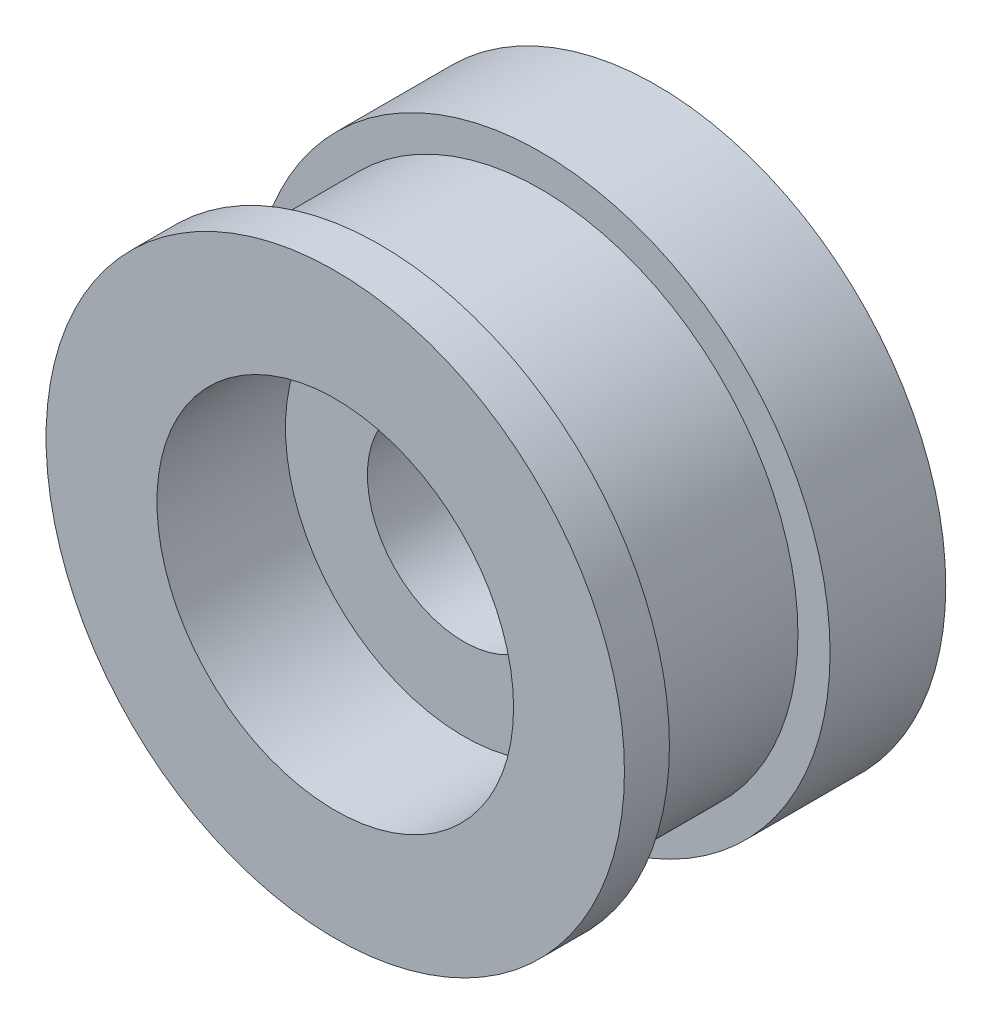
ISO-10303-21;
HEADER;
FILE_DESCRIPTION(('STEP AP214'),'2;1');
FILE_NAME('part.step','',(''),(''),'','','');
FILE_SCHEMA(('AUTOMOTIVE_DESIGN { 1 0 10303 214 1 1 1 1 }'));
ENDSEC;
DATA;
#1=APPLICATION_CONTEXT('core data for automotive mechanical design processes');
#2=APPLICATION_PROTOCOL_DEFINITION('international standard','automotive_design',2000,#1);
#3=PRODUCT_CONTEXT('',#1,'mechanical');
#4=PRODUCT('Part','Part','',(#3));
#5=PRODUCT_RELATED_PRODUCT_CATEGORY('part','',(#4));
#6=PRODUCT_DEFINITION_FORMATION('','',#4);
#7=PRODUCT_DEFINITION_CONTEXT('part definition',#1,'design');
#8=PRODUCT_DEFINITION('design','',#6,#7);
#9=PRODUCT_DEFINITION_SHAPE('','',#8);
#10=(LENGTH_UNIT() NAMED_UNIT(*) SI_UNIT(.MILLI.,.METRE.));
#11=(NAMED_UNIT(*) PLANE_ANGLE_UNIT() SI_UNIT($,.RADIAN.));
#12=(NAMED_UNIT(*) SI_UNIT($,.STERADIAN.) SOLID_ANGLE_UNIT());
#13=UNCERTAINTY_MEASURE_WITH_UNIT(LENGTH_MEASURE(1.E-05),#10,'distance_accuracy_value','');
#14=(GEOMETRIC_REPRESENTATION_CONTEXT(3) GLOBAL_UNCERTAINTY_ASSIGNED_CONTEXT((#13)) GLOBAL_UNIT_ASSIGNED_CONTEXT((#10,
#11,#12)) REPRESENTATION_CONTEXT('',''));
#15=CARTESIAN_POINT('',(0.,0.,0.));
#16=DIRECTION('',(0.,0.,1.));
#17=DIRECTION('',(1.,0.,0.));
#18=AXIS2_PLACEMENT_3D('',#15,#16,#17);
#19=CARTESIAN_POINT('',(0.,0.,1.8));
#20=DIRECTION('',(0.,0.,1.));
#21=DIRECTION('',(1.,0.,0.));
#22=AXIS2_PLACEMENT_3D('',#19,#20,#21);
#23=PLANE('',#22);
#24=CARTESIAN_POINT('',(0.,0.,1.8));
#25=DIRECTION('',(0.,0.,1.));
#26=DIRECTION('',(1.,0.,0.));
#27=AXIS2_PLACEMENT_3D('',#24,#25,#26);
#28=CIRCLE('',#27,4.5);
#29=CARTESIAN_POINT('',(4.5,0.,1.8));
#30=VERTEX_POINT('',#29);
#31=EDGE_CURVE('E10',#30,#30,#28,.T.);
#32=ORIENTED_EDGE('',*,*,#31,.T.);
#33=EDGE_LOOP('',(#32));
#34=FACE_BOUND('',#33,.T.);
#35=CARTESIAN_POINT('',(0.,0.,1.8));
#36=DIRECTION('',(0.,0.,1.));
#37=DIRECTION('',(1.,0.,0.));
#38=AXIS2_PLACEMENT_3D('',#35,#36,#37);
#39=CIRCLE('',#38,4.);
#40=CARTESIAN_POINT('',(4.,0.,1.8));
#41=VERTEX_POINT('',#40);
#42=EDGE_CURVE('E43',#41,#41,#39,.T.);
#43=ORIENTED_EDGE('',*,*,#42,.F.);
#44=EDGE_LOOP('',(#43));
#45=FACE_BOUND('',#44,.T.);
#46=ADVANCED_FACE('F30',(#34,#45),#23,.T.);
#47=CARTESIAN_POINT('',(0.,0.,1.8));
#48=DIRECTION('',(0.,0.,-1.));
#49=DIRECTION('',(-1.,0.,0.));
#50=AXIS2_PLACEMENT_3D('',#47,#48,#49);
#51=CYLINDRICAL_SURFACE('',#50,4.5);
#52=ORIENTED_EDGE('',*,*,#31,.F.);
#53=EDGE_LOOP('',(#52));
#54=FACE_BOUND('',#53,.T.);
#55=CARTESIAN_POINT('',(0.,0.,0.));
#56=DIRECTION('',(0.,0.,1.));
#57=DIRECTION('',(1.,0.,0.));
#58=AXIS2_PLACEMENT_3D('',#55,#56,#57);
#59=CIRCLE('',#58,4.5);
#60=CARTESIAN_POINT('',(4.5,0.,0.));
#61=VERTEX_POINT('',#60);
#62=EDGE_CURVE('E34',#61,#61,#59,.T.);
#63=ORIENTED_EDGE('',*,*,#62,.T.);
#64=EDGE_LOOP('',(#63));
#65=FACE_BOUND('',#64,.T.);
#66=ADVANCED_FACE('F32',(#54,#65),#51,.T.);
#67=CARTESIAN_POINT('',(0.,0.,0.));
#68=DIRECTION('',(0.,0.,1.));
#69=DIRECTION('',(1.,0.,0.));
#70=AXIS2_PLACEMENT_3D('',#67,#68,#69);
#71=PLANE('',#70);
#72=CARTESIAN_POINT('',(0.,0.,0.));
#73=DIRECTION('',(0.,0.,1.));
#74=DIRECTION('',(1.,0.,0.));
#75=AXIS2_PLACEMENT_3D('',#72,#73,#74);
#76=CIRCLE('',#75,1.5);
#77=CARTESIAN_POINT('',(1.5,0.,0.));
#78=VERTEX_POINT('',#77);
#79=EDGE_CURVE('E58',#78,#78,#76,.T.);
#80=ORIENTED_EDGE('',*,*,#79,.T.);
#81=EDGE_LOOP('',(#80));
#82=FACE_BOUND('',#81,.T.);
#83=ORIENTED_EDGE('',*,*,#62,.F.);
#84=EDGE_LOOP('',(#83));
#85=FACE_BOUND('',#84,.T.);
#86=ADVANCED_FACE('F102',(#82,#85),#71,.F.);
#87=CARTESIAN_POINT('',(0.,0.,4.3));
#88=DIRECTION('',(0.,0.,-1.));
#89=DIRECTION('',(-1.,0.,0.));
#90=AXIS2_PLACEMENT_3D('',#87,#88,#89);
#91=CYLINDRICAL_SURFACE('',#90,4.);
#92=CARTESIAN_POINT('',(0.,0.,4.3));
#93=DIRECTION('',(0.,0.,1.));
#94=DIRECTION('',(1.,0.,0.));
#95=AXIS2_PLACEMENT_3D('',#92,#93,#94);
#96=CIRCLE('',#95,4.);
#97=CARTESIAN_POINT('',(4.,0.,4.3));
#98=VERTEX_POINT('',#97);
#99=EDGE_CURVE('E41',#98,#98,#96,.T.);
#100=ORIENTED_EDGE('',*,*,#99,.F.);
#101=EDGE_LOOP('',(#100));
#102=FACE_BOUND('',#101,.T.);
#103=ORIENTED_EDGE('',*,*,#42,.T.);
#104=EDGE_LOOP('',(#103));
#105=FACE_BOUND('',#104,.T.);
#106=ADVANCED_FACE('F96',(#102,#105),#91,.T.);
#107=CARTESIAN_POINT('',(0.,0.,4.3));
#108=DIRECTION('',(0.,0.,1.));
#109=DIRECTION('',(1.,0.,0.));
#110=AXIS2_PLACEMENT_3D('',#107,#108,#109);
#111=PLANE('',#110);
#112=CARTESIAN_POINT('',(0.,0.,4.3));
#113=DIRECTION('',(0.,0.,1.));
#114=DIRECTION('',(1.,0.,0.));
#115=AXIS2_PLACEMENT_3D('',#112,#113,#114);
#116=CIRCLE('',#115,4.5);
#117=CARTESIAN_POINT('',(4.5,0.,4.3));
#118=VERTEX_POINT('',#117);
#119=EDGE_CURVE('E49',#118,#118,#116,.T.);
#120=ORIENTED_EDGE('',*,*,#119,.F.);
#121=EDGE_LOOP('',(#120));
#122=FACE_BOUND('',#121,.T.);
#123=ORIENTED_EDGE('',*,*,#99,.T.);
#124=EDGE_LOOP('',(#123));
#125=FACE_BOUND('',#124,.T.);
#126=ADVANCED_FACE('F90',(#122,#125),#111,.F.);
#127=CARTESIAN_POINT('',(0.,0.,5.));
#128=DIRECTION('',(0.,0.,-1.));
#129=DIRECTION('',(-1.,0.,0.));
#130=AXIS2_PLACEMENT_3D('',#127,#128,#129);
#131=CYLINDRICAL_SURFACE('',#130,4.5);
#132=CARTESIAN_POINT('',(0.,0.,5.));
#133=DIRECTION('',(0.,0.,1.));
#134=DIRECTION('',(1.,0.,0.));
#135=AXIS2_PLACEMENT_3D('',#132,#133,#134);
#136=CIRCLE('',#135,4.5);
#137=CARTESIAN_POINT('',(4.5,0.,5.));
#138=VERTEX_POINT('',#137);
#139=EDGE_CURVE('E46',#138,#138,#136,.T.);
#140=ORIENTED_EDGE('',*,*,#139,.F.);
#141=EDGE_LOOP('',(#140));
#142=FACE_BOUND('',#141,.T.);
#143=ORIENTED_EDGE('',*,*,#119,.T.);
#144=EDGE_LOOP('',(#143));
#145=FACE_BOUND('',#144,.T.);
#146=ADVANCED_FACE('F84',(#142,#145),#131,.T.);
#147=CARTESIAN_POINT('',(0.,0.,5.));
#148=DIRECTION('',(0.,0.,1.));
#149=DIRECTION('',(1.,0.,0.));
#150=AXIS2_PLACEMENT_3D('',#147,#148,#149);
#151=PLANE('',#150);
#152=CARTESIAN_POINT('',(0.,0.,5.));
#153=DIRECTION('',(0.,0.,1.));
#154=DIRECTION('',(1.,0.,0.));
#155=AXIS2_PLACEMENT_3D('',#152,#153,#154);
#156=CIRCLE('',#155,2.775);
#157=CARTESIAN_POINT('',(2.775,0.,5.));
#158=VERTEX_POINT('',#157);
#159=EDGE_CURVE('E55',#158,#158,#156,.T.);
#160=ORIENTED_EDGE('',*,*,#159,.F.);
#161=EDGE_LOOP('',(#160));
#162=FACE_BOUND('',#161,.T.);
#163=ORIENTED_EDGE('',*,*,#139,.T.);
#164=EDGE_LOOP('',(#163));
#165=FACE_BOUND('',#164,.T.);
#166=ADVANCED_FACE('F78',(#162,#165),#151,.T.);
#167=CARTESIAN_POINT('',(0.,0.,3.));
#168=DIRECTION('',(0.,0.,1.));
#169=DIRECTION('',(1.,0.,0.));
#170=AXIS2_PLACEMENT_3D('',#167,#168,#169);
#171=CYLINDRICAL_SURFACE('',#170,2.775);
#172=CARTESIAN_POINT('',(0.,0.,3.));
#173=DIRECTION('',(0.,0.,1.));
#174=DIRECTION('',(1.,0.,0.));
#175=AXIS2_PLACEMENT_3D('',#172,#173,#174);
#176=CIRCLE('',#175,2.775);
#177=CARTESIAN_POINT('',(2.775,0.,3.));
#178=VERTEX_POINT('',#177);
#179=EDGE_CURVE('E52',#178,#178,#176,.T.);
#180=ORIENTED_EDGE('',*,*,#179,.F.);
#181=EDGE_LOOP('',(#180));
#182=FACE_BOUND('',#181,.T.);
#183=ORIENTED_EDGE('',*,*,#159,.T.);
#184=EDGE_LOOP('',(#183));
#185=FACE_BOUND('',#184,.T.);
#186=ADVANCED_FACE('F72',(#182,#185),#171,.F.);
#187=CARTESIAN_POINT('',(0.,0.,3.));
#188=DIRECTION('',(0.,0.,1.));
#189=DIRECTION('',(1.,0.,0.));
#190=AXIS2_PLACEMENT_3D('',#187,#188,#189);
#191=PLANE('',#190);
#192=CARTESIAN_POINT('',(0.,0.,3.));
#193=DIRECTION('',(0.,0.,1.));
#194=DIRECTION('',(1.,0.,0.));
#195=AXIS2_PLACEMENT_3D('',#192,#193,#194);
#196=CIRCLE('',#195,1.49999999999999);
#197=CARTESIAN_POINT('',(1.49999999999999,0.,3.));
#198=VERTEX_POINT('',#197);
#199=EDGE_CURVE('E63',#198,#198,#196,.T.);
#200=ORIENTED_EDGE('',*,*,#199,.F.);
#201=EDGE_LOOP('',(#200));
#202=FACE_BOUND('',#201,.T.);
#203=ORIENTED_EDGE('',*,*,#179,.T.);
#204=EDGE_LOOP('',(#203));
#205=FACE_BOUND('',#204,.T.);
#206=ADVANCED_FACE('F69',(#202,#205),#191,.T.);
#207=CARTESIAN_POINT('',(0.,0.,3.));
#208=DIRECTION('',(0.,0.,1.));
#209=DIRECTION('',(1.,0.,0.));
#210=AXIS2_PLACEMENT_3D('',#207,#208,#209);
#211=CYLINDRICAL_SURFACE('',#210,1.49999999999999);
#212=ORIENTED_EDGE('',*,*,#79,.F.);
#213=EDGE_LOOP('',(#212));
#214=FACE_BOUND('',#213,.T.);
#215=ORIENTED_EDGE('',*,*,#199,.T.);
#216=EDGE_LOOP('',(#215));
#217=FACE_BOUND('',#216,.T.);
#218=ADVANCED_FACE('F67',(#214,#217),#211,.F.);
#219=CLOSED_SHELL('',(#46,#66,#86,#106,#126,#146,#166,#186,#206,#218));
#220=MANIFOLD_SOLID_BREP('B2',#219);
#221=ADVANCED_BREP_SHAPE_REPRESENTATION('',(#18,#220),#14);
#222=SHAPE_DEFINITION_REPRESENTATION(#9,#221);
ENDSEC;
END-ISO-10303-21;
